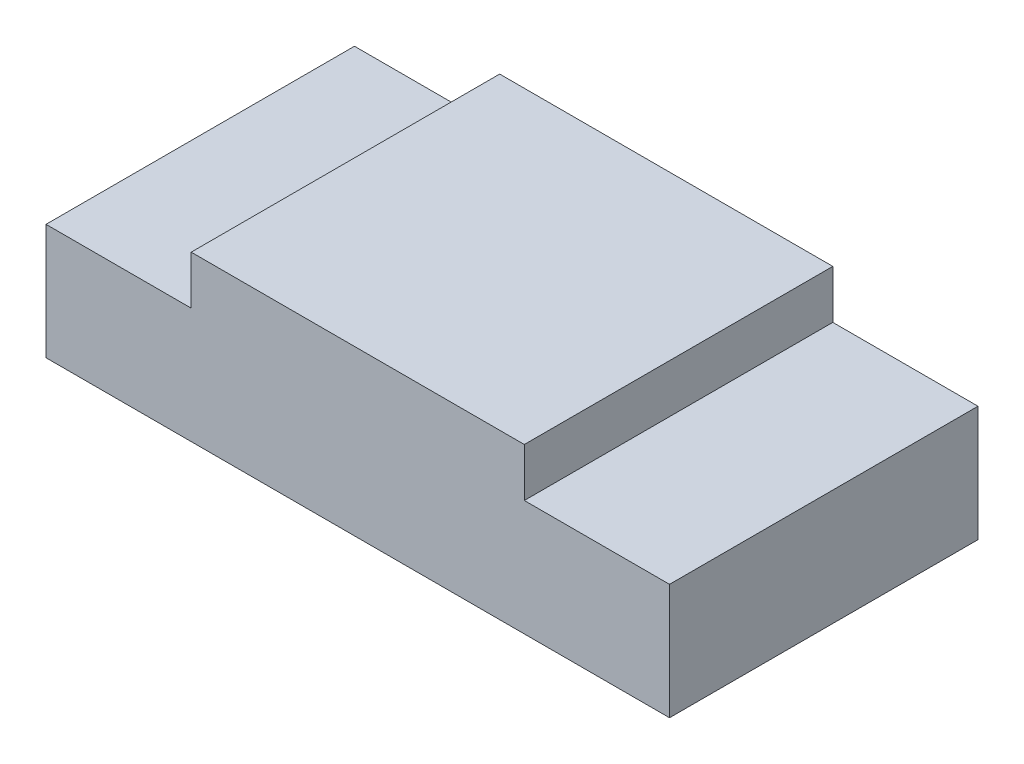
ISO-10303-21;
HEADER;
FILE_DESCRIPTION(('STEP AP214'),'2;1');
FILE_NAME('part.step','',(''),(''),'','','');
FILE_SCHEMA(('AUTOMOTIVE_DESIGN { 1 0 10303 214 1 1 1 1 }'));
ENDSEC;
DATA;
#1=APPLICATION_CONTEXT('core data for automotive mechanical design processes');
#2=APPLICATION_PROTOCOL_DEFINITION('international standard','automotive_design',2000,#1);
#3=PRODUCT_CONTEXT('',#1,'mechanical');
#4=PRODUCT('Part','Part','',(#3));
#5=PRODUCT_RELATED_PRODUCT_CATEGORY('part','',(#4));
#6=PRODUCT_DEFINITION_FORMATION('','',#4);
#7=PRODUCT_DEFINITION_CONTEXT('part definition',#1,'design');
#8=PRODUCT_DEFINITION('design','',#6,#7);
#9=PRODUCT_DEFINITION_SHAPE('','',#8);
#10=(LENGTH_UNIT() NAMED_UNIT(*) SI_UNIT(.MILLI.,.METRE.));
#11=(NAMED_UNIT(*) PLANE_ANGLE_UNIT() SI_UNIT($,.RADIAN.));
#12=(NAMED_UNIT(*) SI_UNIT($,.STERADIAN.) SOLID_ANGLE_UNIT());
#13=UNCERTAINTY_MEASURE_WITH_UNIT(LENGTH_MEASURE(1.E-05),#10,'distance_accuracy_value','');
#14=(GEOMETRIC_REPRESENTATION_CONTEXT(3) GLOBAL_UNCERTAINTY_ASSIGNED_CONTEXT((#13)) GLOBAL_UNIT_ASSIGNED_CONTEXT((#10,
#11,#12)) REPRESENTATION_CONTEXT('',''));
#15=CARTESIAN_POINT('',(0.,0.,0.));
#16=DIRECTION('',(0.,0.,1.));
#17=DIRECTION('',(1.,0.,0.));
#18=AXIS2_PLACEMENT_3D('',#15,#16,#17);
#19=CARTESIAN_POINT('',(-38.8158332132392,317.5,-28.4924733161011));
#20=DIRECTION('',(1.,0.,0.));
#21=DIRECTION('',(0.,0.,-1.));
#22=AXIS2_PLACEMENT_3D('',#19,#20,#21);
#23=PLANE('',#22);
#24=DIRECTION('',(0.,-1.,0.));
#25=VECTOR('',#24,1.);
#26=CARTESIAN_POINT('',(-38.8158332132391,317.5,568.407526683899));
#27=LINE('',#26,#25);
#28=CARTESIAN_POINT('',(-38.8158332132391,223.64103162876,568.407526683899));
#29=VERTEX_POINT('',#28);
#30=CARTESIAN_POINT('',(-38.8158332132391,0.,568.407526683899));
#31=VERTEX_POINT('',#30);
#32=EDGE_CURVE('E11',#29,#31,#27,.T.);
#33=ORIENTED_EDGE('',*,*,#32,.F.);
#34=DIRECTION('',(0.,0.,1.));
#35=VECTOR('',#34,1.);
#36=CARTESIAN_POINT('',(-38.8158332132391,223.64103162876,-28.4924733161011));
#37=LINE('',#36,#35);
#38=CARTESIAN_POINT('',(-38.8158332132391,223.64103162876,-28.4924733161011));
#39=VERTEX_POINT('',#38);
#40=EDGE_CURVE('E98',#39,#29,#37,.T.);
#41=ORIENTED_EDGE('',*,*,#40,.F.);
#42=DIRECTION('',(0.,-1.,0.));
#43=VECTOR('',#42,1.);
#44=CARTESIAN_POINT('',(-38.8158332132392,317.5,-28.4924733161011));
#45=LINE('',#44,#43);
#46=CARTESIAN_POINT('',(-38.8158332132392,0.,-28.4924733161011));
#47=VERTEX_POINT('',#46);
#48=EDGE_CURVE('E110',#39,#47,#45,.T.);
#49=ORIENTED_EDGE('',*,*,#48,.T.);
#50=DIRECTION('',(0.,0.,1.));
#51=VECTOR('',#50,1.);
#52=CARTESIAN_POINT('',(-38.8158332132392,0.,-28.4924733161011));
#53=LINE('',#52,#51);
#54=EDGE_CURVE('E143',#47,#31,#53,.T.);
#55=ORIENTED_EDGE('',*,*,#54,.T.);
#56=EDGE_LOOP('',(#33,#41,#49,#55));
#57=FACE_BOUND('',#56,.T.);
#58=ADVANCED_FACE('F31',(#57),#23,.F.);
#59=CARTESIAN_POINT('',(-38.8158332132391,317.5,568.407526683899));
#60=DIRECTION('',(0.,0.,-1.));
#61=DIRECTION('',(-1.,0.,0.));
#62=AXIS2_PLACEMENT_3D('',#59,#60,#61);
#63=PLANE('',#62);
#64=DIRECTION('',(1.,0.,0.));
#65=VECTOR('',#64,1.);
#66=CARTESIAN_POINT('',(-38.8158332132391,317.5,568.407526683899));
#67=LINE('',#66,#65);
#68=CARTESIAN_POINT('',(242.142043030595,317.5,568.407526683899));
#69=VERTEX_POINT('',#68);
#70=CARTESIAN_POINT('',(886.726290542927,317.5,568.407526683899));
#71=VERTEX_POINT('',#70);
#72=EDGE_CURVE('E122',#69,#71,#67,.T.);
#73=ORIENTED_EDGE('',*,*,#72,.F.);
#74=DIRECTION('',(0.,1.,0.));
#75=VECTOR('',#74,1.);
#76=CARTESIAN_POINT('',(242.142043030595,317.5,568.407526683899));
#77=LINE('',#76,#75);
#78=CARTESIAN_POINT('',(242.142043030595,223.64103162876,568.407526683899));
#79=VERTEX_POINT('',#78);
#80=EDGE_CURVE('E45',#79,#69,#77,.T.);
#81=ORIENTED_EDGE('',*,*,#80,.F.);
#82=DIRECTION('',(1.,0.,0.));
#83=VECTOR('',#82,1.);
#84=CARTESIAN_POINT('',(-38.8158332132391,223.64103162876,568.407526683899));
#85=LINE('',#84,#83);
#86=EDGE_CURVE('E167',#29,#79,#85,.T.);
#87=ORIENTED_EDGE('',*,*,#86,.F.);
#88=ORIENTED_EDGE('',*,*,#32,.T.);
#89=DIRECTION('',(1.,0.,0.));
#90=VECTOR('',#89,1.);
#91=CARTESIAN_POINT('',(-38.8158332132391,0.,568.407526683899));
#92=LINE('',#91,#90);
#93=CARTESIAN_POINT('',(1167.68416678676,0.,568.407526683899));
#94=VERTEX_POINT('',#93);
#95=EDGE_CURVE('E139',#31,#94,#92,.T.);
#96=ORIENTED_EDGE('',*,*,#95,.T.);
#97=DIRECTION('',(0.,-1.,0.));
#98=VECTOR('',#97,1.);
#99=CARTESIAN_POINT('',(1167.68416678676,317.5,568.407526683899));
#100=LINE('',#99,#98);
#101=CARTESIAN_POINT('',(1167.68416678676,223.64103162876,568.407526683899));
#102=VERTEX_POINT('',#101);
#103=EDGE_CURVE('E38',#102,#94,#100,.T.);
#104=ORIENTED_EDGE('',*,*,#103,.F.);
#105=DIRECTION('',(1.,0.,0.));
#106=VECTOR('',#105,1.);
#107=CARTESIAN_POINT('',(1167.68416678676,223.64103162876,568.407526683899));
#108=LINE('',#107,#106);
#109=CARTESIAN_POINT('',(886.726290542927,223.64103162876,568.407526683899));
#110=VERTEX_POINT('',#109);
#111=EDGE_CURVE('E155',#110,#102,#108,.T.);
#112=ORIENTED_EDGE('',*,*,#111,.F.);
#113=DIRECTION('',(0.,-1.,0.));
#114=VECTOR('',#113,1.);
#115=CARTESIAN_POINT('',(886.726290542927,317.5,568.407526683899));
#116=LINE('',#115,#114);
#117=EDGE_CURVE('E157',#71,#110,#116,.T.);
#118=ORIENTED_EDGE('',*,*,#117,.F.);
#119=EDGE_LOOP('',(#73,#81,#87,#88,#96,#104,#112,#118));
#120=FACE_BOUND('',#119,.T.);
#121=ADVANCED_FACE('F141',(#120),#63,.F.);
#122=CARTESIAN_POINT('',(1167.68416678676,317.5,-28.4924733161011));
#123=DIRECTION('',(-1.,0.,0.));
#124=DIRECTION('',(0.,0.,1.));
#125=AXIS2_PLACEMENT_3D('',#122,#123,#124);
#126=PLANE('',#125);
#127=DIRECTION('',(0.,-1.,0.));
#128=VECTOR('',#127,1.);
#129=CARTESIAN_POINT('',(1167.68416678676,317.5,-28.4924733161011));
#130=LINE('',#129,#128);
#131=CARTESIAN_POINT('',(1167.68416678676,223.64103162876,-28.4924733161011));
#132=VERTEX_POINT('',#131);
#133=CARTESIAN_POINT('',(1167.68416678676,0.,-28.4924733161011));
#134=VERTEX_POINT('',#133);
#135=EDGE_CURVE('E117',#132,#134,#130,.T.);
#136=ORIENTED_EDGE('',*,*,#135,.F.);
#137=DIRECTION('',(0.,0.,1.));
#138=VECTOR('',#137,1.);
#139=CARTESIAN_POINT('',(1167.68416678676,223.64103162876,-28.4924733161011));
#140=LINE('',#139,#138);
#141=EDGE_CURVE('E135',#132,#102,#140,.T.);
#142=ORIENTED_EDGE('',*,*,#141,.T.);
#143=ORIENTED_EDGE('',*,*,#103,.T.);
#144=DIRECTION('',(0.,0.,-1.));
#145=VECTOR('',#144,1.);
#146=CARTESIAN_POINT('',(1167.68416678676,0.,-28.4924733161011));
#147=LINE('',#146,#145);
#148=EDGE_CURVE('E134',#94,#134,#147,.T.);
#149=ORIENTED_EDGE('',*,*,#148,.T.);
#150=EDGE_LOOP('',(#136,#142,#143,#149));
#151=FACE_BOUND('',#150,.T.);
#152=ADVANCED_FACE('F132',(#151),#126,.F.);
#153=CARTESIAN_POINT('',(-38.8158332132392,317.5,-28.4924733161011));
#154=DIRECTION('',(0.,0.,1.));
#155=DIRECTION('',(1.,0.,0.));
#156=AXIS2_PLACEMENT_3D('',#153,#154,#155);
#157=PLANE('',#156);
#158=DIRECTION('',(1.,0.,0.));
#159=VECTOR('',#158,1.);
#160=CARTESIAN_POINT('',(-38.8158332132391,223.64103162876,-28.4924733161011));
#161=LINE('',#160,#159);
#162=CARTESIAN_POINT('',(242.142043030595,223.64103162876,-28.4924733161011));
#163=VERTEX_POINT('',#162);
#164=EDGE_CURVE('E94',#39,#163,#161,.T.);
#165=ORIENTED_EDGE('',*,*,#164,.T.);
#166=DIRECTION('',(0.,1.,0.));
#167=VECTOR('',#166,1.);
#168=CARTESIAN_POINT('',(242.142043030595,317.5,-28.4924733161011));
#169=LINE('',#168,#167);
#170=CARTESIAN_POINT('',(242.142043030595,317.5,-28.4924733161011));
#171=VERTEX_POINT('',#170);
#172=EDGE_CURVE('E105',#163,#171,#169,.T.);
#173=ORIENTED_EDGE('',*,*,#172,.T.);
#174=DIRECTION('',(-1.,0.,0.));
#175=VECTOR('',#174,1.);
#176=CARTESIAN_POINT('',(-38.8158332132392,317.5,-28.4924733161011));
#177=LINE('',#176,#175);
#178=CARTESIAN_POINT('',(886.726290542927,317.5,-28.4924733161011));
#179=VERTEX_POINT('',#178);
#180=EDGE_CURVE('E118',#179,#171,#177,.T.);
#181=ORIENTED_EDGE('',*,*,#180,.F.);
#182=DIRECTION('',(0.,-1.,0.));
#183=VECTOR('',#182,1.);
#184=CARTESIAN_POINT('',(886.726290542927,317.5,-28.4924733161011));
#185=LINE('',#184,#183);
#186=CARTESIAN_POINT('',(886.726290542927,223.64103162876,-28.4924733161011));
#187=VERTEX_POINT('',#186);
#188=EDGE_CURVE('E53',#179,#187,#185,.T.);
#189=ORIENTED_EDGE('',*,*,#188,.T.);
#190=DIRECTION('',(1.,0.,0.));
#191=VECTOR('',#190,1.);
#192=CARTESIAN_POINT('',(1167.68416678676,223.64103162876,-28.4924733161011));
#193=LINE('',#192,#191);
#194=EDGE_CURVE('E152',#187,#132,#193,.T.);
#195=ORIENTED_EDGE('',*,*,#194,.T.);
#196=ORIENTED_EDGE('',*,*,#135,.T.);
#197=DIRECTION('',(-1.,0.,0.));
#198=VECTOR('',#197,1.);
#199=CARTESIAN_POINT('',(-38.8158332132392,0.,-28.4924733161011));
#200=LINE('',#199,#198);
#201=EDGE_CURVE('E115',#134,#47,#200,.T.);
#202=ORIENTED_EDGE('',*,*,#201,.T.);
#203=ORIENTED_EDGE('',*,*,#48,.F.);
#204=EDGE_LOOP('',(#165,#173,#181,#189,#195,#196,#202,#203));
#205=FACE_BOUND('',#204,.T.);
#206=ADVANCED_FACE('F113',(#205),#157,.F.);
#207=CARTESIAN_POINT('',(-38.8158332132391,317.5,568.407526683899));
#208=DIRECTION('',(0.,1.,0.));
#209=DIRECTION('',(0.,0.,1.));
#210=AXIS2_PLACEMENT_3D('',#207,#208,#209);
#211=PLANE('',#210);
#212=DIRECTION('',(0.,0.,1.));
#213=VECTOR('',#212,1.);
#214=CARTESIAN_POINT('',(242.142043030595,317.5,-28.4924733161011));
#215=LINE('',#214,#213);
#216=EDGE_CURVE('E160',#171,#69,#215,.T.);
#217=ORIENTED_EDGE('',*,*,#216,.T.);
#218=ORIENTED_EDGE('',*,*,#72,.T.);
#219=DIRECTION('',(0.,0.,1.));
#220=VECTOR('',#219,1.);
#221=CARTESIAN_POINT('',(886.726290542927,317.5,-28.4924733161011));
#222=LINE('',#221,#220);
#223=EDGE_CURVE('E149',#179,#71,#222,.T.);
#224=ORIENTED_EDGE('',*,*,#223,.F.);
#225=ORIENTED_EDGE('',*,*,#180,.T.);
#226=EDGE_LOOP('',(#217,#218,#224,#225));
#227=FACE_BOUND('',#226,.T.);
#228=ADVANCED_FACE('F171',(#227),#211,.T.);
#229=CARTESIAN_POINT('',(-38.8158332132391,0.,568.407526683899));
#230=DIRECTION('',(0.,1.,0.));
#231=DIRECTION('',(0.,0.,1.));
#232=AXIS2_PLACEMENT_3D('',#229,#230,#231);
#233=PLANE('',#232);
#234=ORIENTED_EDGE('',*,*,#54,.F.);
#235=ORIENTED_EDGE('',*,*,#201,.F.);
#236=ORIENTED_EDGE('',*,*,#148,.F.);
#237=ORIENTED_EDGE('',*,*,#95,.F.);
#238=EDGE_LOOP('',(#234,#235,#236,#237));
#239=FACE_BOUND('',#238,.T.);
#240=ADVANCED_FACE('F145',(#239),#233,.F.);
#241=CARTESIAN_POINT('',(1167.68416678676,223.64103162876,-28.4924733161011));
#242=DIRECTION('',(0.,-1.,0.));
#243=DIRECTION('',(0.,0.,-1.));
#244=AXIS2_PLACEMENT_3D('',#241,#242,#243);
#245=PLANE('',#244);
#246=ORIENTED_EDGE('',*,*,#111,.T.);
#247=ORIENTED_EDGE('',*,*,#141,.F.);
#248=ORIENTED_EDGE('',*,*,#194,.F.);
#249=DIRECTION('',(0.,0.,1.));
#250=VECTOR('',#249,1.);
#251=CARTESIAN_POINT('',(886.726290542927,223.64103162876,-28.4924733161011));
#252=LINE('',#251,#250);
#253=EDGE_CURVE('E151',#187,#110,#252,.T.);
#254=ORIENTED_EDGE('',*,*,#253,.T.);
#255=EDGE_LOOP('',(#246,#247,#248,#254));
#256=FACE_BOUND('',#255,.T.);
#257=ADVANCED_FACE('F175',(#256),#245,.F.);
#258=CARTESIAN_POINT('',(886.726290542927,317.5,-28.4924733161011));
#259=DIRECTION('',(-1.,0.,0.));
#260=DIRECTION('',(0.,0.,1.));
#261=AXIS2_PLACEMENT_3D('',#258,#259,#260);
#262=PLANE('',#261);
#263=ORIENTED_EDGE('',*,*,#117,.T.);
#264=ORIENTED_EDGE('',*,*,#253,.F.);
#265=ORIENTED_EDGE('',*,*,#188,.F.);
#266=ORIENTED_EDGE('',*,*,#223,.T.);
#267=EDGE_LOOP('',(#263,#264,#265,#266));
#268=FACE_BOUND('',#267,.T.);
#269=ADVANCED_FACE('F173',(#268),#262,.F.);
#270=CARTESIAN_POINT('',(242.142043030595,317.5,-28.4924733161011));
#271=DIRECTION('',(1.,0.,0.));
#272=DIRECTION('',(0.,0.,-1.));
#273=AXIS2_PLACEMENT_3D('',#270,#271,#272);
#274=PLANE('',#273);
#275=ORIENTED_EDGE('',*,*,#80,.T.);
#276=ORIENTED_EDGE('',*,*,#216,.F.);
#277=ORIENTED_EDGE('',*,*,#172,.F.);
#278=DIRECTION('',(0.,0.,1.));
#279=VECTOR('',#278,1.);
#280=CARTESIAN_POINT('',(242.142043030595,223.64103162876,-28.4924733161011));
#281=LINE('',#280,#279);
#282=EDGE_CURVE('E100',#163,#79,#281,.T.);
#283=ORIENTED_EDGE('',*,*,#282,.T.);
#284=EDGE_LOOP('',(#275,#276,#277,#283));
#285=FACE_BOUND('',#284,.T.);
#286=ADVANCED_FACE('F183',(#285),#274,.F.);
#287=CARTESIAN_POINT('',(-38.8158332132391,223.64103162876,-28.4924733161011));
#288=DIRECTION('',(0.,-1.,0.));
#289=DIRECTION('',(0.,0.,-1.));
#290=AXIS2_PLACEMENT_3D('',#287,#288,#289);
#291=PLANE('',#290);
#292=ORIENTED_EDGE('',*,*,#86,.T.);
#293=ORIENTED_EDGE('',*,*,#282,.F.);
#294=ORIENTED_EDGE('',*,*,#164,.F.);
#295=ORIENTED_EDGE('',*,*,#40,.T.);
#296=EDGE_LOOP('',(#292,#293,#294,#295));
#297=FACE_BOUND('',#296,.T.);
#298=ADVANCED_FACE('F97',(#297),#291,.F.);
#299=CLOSED_SHELL('',(#58,#121,#152,#206,#228,#240,#257,#269,#286,#298));
#300=MANIFOLD_SOLID_BREP('B2',#299);
#301=ADVANCED_BREP_SHAPE_REPRESENTATION('',(#18,#300),#14);
#302=SHAPE_DEFINITION_REPRESENTATION(#9,#301);
ENDSEC;
END-ISO-10303-21;
